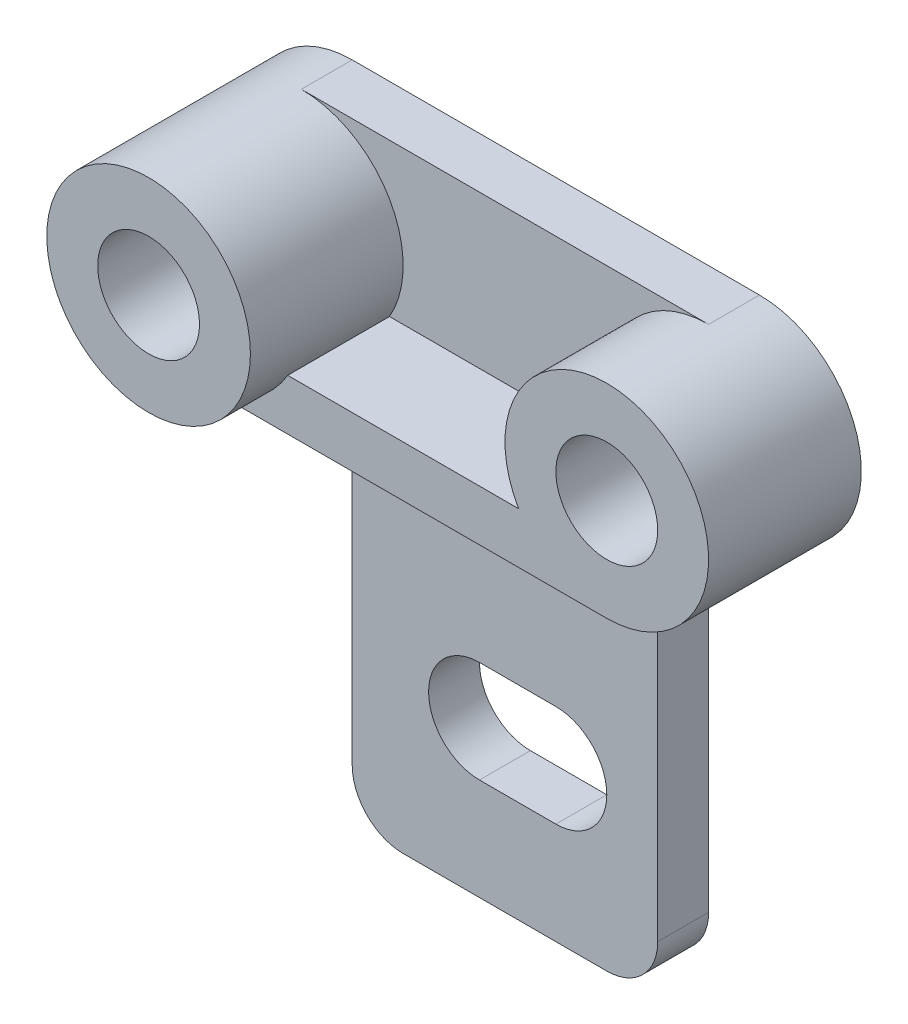
ISO-10303-21;
HEADER;
FILE_DESCRIPTION(('STEP AP214'),'2;1');
FILE_NAME('part.step','',(''),(''),'','','');
FILE_SCHEMA(('AUTOMOTIVE_DESIGN { 1 0 10303 214 1 1 1 1 }'));
ENDSEC;
DATA;
#1=APPLICATION_CONTEXT('core data for automotive mechanical design processes');
#2=APPLICATION_PROTOCOL_DEFINITION('international standard','automotive_design',2000,#1);
#3=PRODUCT_CONTEXT('',#1,'mechanical');
#4=PRODUCT('Part','Part','',(#3));
#5=PRODUCT_RELATED_PRODUCT_CATEGORY('part','',(#4));
#6=PRODUCT_DEFINITION_FORMATION('','',#4);
#7=PRODUCT_DEFINITION_CONTEXT('part definition',#1,'design');
#8=PRODUCT_DEFINITION('design','',#6,#7);
#9=PRODUCT_DEFINITION_SHAPE('','',#8);
#10=(LENGTH_UNIT() NAMED_UNIT(*) SI_UNIT(.MILLI.,.METRE.));
#11=(NAMED_UNIT(*) PLANE_ANGLE_UNIT() SI_UNIT($,.RADIAN.));
#12=(NAMED_UNIT(*) SI_UNIT($,.STERADIAN.) SOLID_ANGLE_UNIT());
#13=UNCERTAINTY_MEASURE_WITH_UNIT(LENGTH_MEASURE(1.E-05),#10,'distance_accuracy_value','');
#14=(GEOMETRIC_REPRESENTATION_CONTEXT(3) GLOBAL_UNCERTAINTY_ASSIGNED_CONTEXT((#13)) GLOBAL_UNIT_ASSIGNED_CONTEXT((#10,
#11,#12)) REPRESENTATION_CONTEXT('',''));
#15=CARTESIAN_POINT('',(0.,0.,0.));
#16=DIRECTION('',(0.,0.,1.));
#17=DIRECTION('',(1.,0.,0.));
#18=AXIS2_PLACEMENT_3D('',#15,#16,#17);
#19=CARTESIAN_POINT('',(40.,100.,30.));
#20=DIRECTION('',(0.,0.,-1.));
#21=DIRECTION('',(-1.,0.,0.));
#22=AXIS2_PLACEMENT_3D('',#19,#20,#21);
#23=CYLINDRICAL_SURFACE('',#22,20.);
#24=DIRECTION('',(0.,0.,-1.));
#25=VECTOR('',#24,1.);
#26=CARTESIAN_POINT('',(40.,120.,10.));
#27=LINE('',#26,#25);
#28=CARTESIAN_POINT('',(40.,120.,10.));
#29=VERTEX_POINT('',#28);
#30=CARTESIAN_POINT('',(40.,120.,0.));
#31=VERTEX_POINT('',#30);
#32=EDGE_CURVE('E196',#29,#31,#27,.T.);
#33=ORIENTED_EDGE('',*,*,#32,.F.);
#34=CARTESIAN_POINT('',(40.,100.,10.));
#35=DIRECTION('',(0.,0.,1.));
#36=DIRECTION('',(1.,0.,0.));
#37=AXIS2_PLACEMENT_3D('',#34,#35,#36);
#38=CIRCLE('',#37,20.);
#39=CARTESIAN_POINT('',(22.6794919243112,90.,10.));
#40=VERTEX_POINT('',#39);
#41=EDGE_CURVE('E184',#29,#40,#38,.T.);
#42=ORIENTED_EDGE('',*,*,#41,.T.);
#43=DIRECTION('',(0.,0.,-1.));
#44=VECTOR('',#43,1.);
#45=CARTESIAN_POINT('',(22.6794919243112,90.,30.));
#46=LINE('',#45,#44);
#47=CARTESIAN_POINT('',(22.6794919243112,90.,30.));
#48=VERTEX_POINT('',#47);
#49=EDGE_CURVE('E239',#48,#40,#46,.T.);
#50=ORIENTED_EDGE('',*,*,#49,.F.);
#51=CARTESIAN_POINT('',(40.,100.,30.));
#52=DIRECTION('',(0.,0.,1.));
#53=DIRECTION('',(1.,0.,0.));
#54=AXIS2_PLACEMENT_3D('',#51,#52,#53);
#55=CIRCLE('',#54,20.);
#56=CARTESIAN_POINT('',(40.,80.,30.));
#57=VERTEX_POINT('',#56);
#58=EDGE_CURVE('E215',#57,#48,#55,.T.);
#59=ORIENTED_EDGE('',*,*,#58,.F.);
#60=DIRECTION('',(0.,0.,-1.));
#61=VECTOR('',#60,1.);
#62=CARTESIAN_POINT('',(40.,80.,30.));
#63=LINE('',#62,#61);
#64=CARTESIAN_POINT('',(40.,80.,0.));
#65=VERTEX_POINT('',#64);
#66=EDGE_CURVE('E225',#57,#65,#63,.T.);
#67=ORIENTED_EDGE('',*,*,#66,.T.);
#68=CARTESIAN_POINT('',(40.,100.,0.));
#69=DIRECTION('',(0.,0.,1.));
#70=DIRECTION('',(1.,0.,0.));
#71=AXIS2_PLACEMENT_3D('',#68,#69,#70);
#72=CIRCLE('',#71,20.);
#73=EDGE_CURVE('E228',#65,#31,#72,.T.);
#74=ORIENTED_EDGE('',*,*,#73,.T.);
#75=EDGE_LOOP('',(#33,#42,#50,#59,#67,#74));
#76=FACE_BOUND('',#75,.T.);
#77=ADVANCED_FACE('F63',(#76),#23,.T.);
#78=CARTESIAN_POINT('',(0.,0.,10.));
#79=DIRECTION('',(0.,0.,1.));
#80=DIRECTION('',(1.,0.,0.));
#81=AXIS2_PLACEMENT_3D('',#78,#79,#80);
#82=PLANE('',#81);
#83=DIRECTION('',(0.,1.,0.));
#84=VECTOR('',#83,1.);
#85=CARTESIAN_POINT('',(-30.,0.,10.));
#86=LINE('',#85,#84);
#87=CARTESIAN_POINT('',(-30.,10.,10.));
#88=VERTEX_POINT('',#87);
#89=CARTESIAN_POINT('',(-30.,80.,10.));
#90=VERTEX_POINT('',#89);
#91=EDGE_CURVE('E283',#88,#90,#86,.T.);
#92=ORIENTED_EDGE('',*,*,#91,.F.);
#93=CARTESIAN_POINT('',(-20.,10.,10.));
#94=DIRECTION('',(0.,0.,1.));
#95=DIRECTION('',(1.,0.,0.));
#96=AXIS2_PLACEMENT_3D('',#93,#94,#95);
#97=CIRCLE('',#96,10.);
#98=CARTESIAN_POINT('',(-20.,0.,10.));
#99=VERTEX_POINT('',#98);
#100=EDGE_CURVE('E71',#88,#99,#97,.T.);
#101=ORIENTED_EDGE('',*,*,#100,.T.);
#102=DIRECTION('',(1.,0.,0.));
#103=VECTOR('',#102,1.);
#104=CARTESIAN_POINT('',(-30.,0.,10.));
#105=LINE('',#104,#103);
#106=CARTESIAN_POINT('',(20.,0.,10.));
#107=VERTEX_POINT('',#106);
#108=EDGE_CURVE('E281',#99,#107,#105,.T.);
#109=ORIENTED_EDGE('',*,*,#108,.T.);
#110=CARTESIAN_POINT('',(20.,10.,10.));
#111=DIRECTION('',(0.,0.,1.));
#112=DIRECTION('',(1.,0.,0.));
#113=AXIS2_PLACEMENT_3D('',#110,#111,#112);
#114=CIRCLE('',#113,10.);
#115=CARTESIAN_POINT('',(30.,10.,10.));
#116=VERTEX_POINT('',#115);
#117=EDGE_CURVE('E78',#107,#116,#114,.T.);
#118=ORIENTED_EDGE('',*,*,#117,.T.);
#119=DIRECTION('',(0.,1.,0.));
#120=VECTOR('',#119,1.);
#121=CARTESIAN_POINT('',(30.,0.,10.));
#122=LINE('',#121,#120);
#123=CARTESIAN_POINT('',(30.,80.,10.));
#124=VERTEX_POINT('',#123);
#125=EDGE_CURVE('E278',#116,#124,#122,.T.);
#126=ORIENTED_EDGE('',*,*,#125,.T.);
#127=DIRECTION('',(1.,0.,0.));
#128=VECTOR('',#127,1.);
#129=CARTESIAN_POINT('',(-30.,80.,10.));
#130=LINE('',#129,#128);
#131=EDGE_CURVE('E275',#90,#124,#130,.T.);
#132=ORIENTED_EDGE('',*,*,#131,.F.);
#133=EDGE_LOOP('',(#92,#101,#109,#118,#126,#132));
#134=FACE_BOUND('',#133,.T.);
#135=DIRECTION('',(1.,0.,0.));
#136=VECTOR('',#135,1.);
#137=CARTESIAN_POINT('',(-5.,20.,10.));
#138=LINE('',#137,#136);
#139=CARTESIAN_POINT('',(-5.,20.,10.));
#140=VERTEX_POINT('',#139);
#141=CARTESIAN_POINT('',(10.,20.,10.));
#142=VERTEX_POINT('',#141);
#143=EDGE_CURVE('E245',#140,#142,#138,.T.);
#144=ORIENTED_EDGE('',*,*,#143,.F.);
#145=CARTESIAN_POINT('',(-5.,30.,10.));
#146=DIRECTION('',(0.,0.,1.));
#147=DIRECTION('',(1.,0.,0.));
#148=AXIS2_PLACEMENT_3D('',#145,#146,#147);
#149=CIRCLE('',#148,10.);
#150=CARTESIAN_POINT('',(-5.,40.,10.));
#151=VERTEX_POINT('',#150);
#152=EDGE_CURVE('E243',#151,#140,#149,.T.);
#153=ORIENTED_EDGE('',*,*,#152,.F.);
#154=DIRECTION('',(1.,0.,0.));
#155=VECTOR('',#154,1.);
#156=CARTESIAN_POINT('',(-5.,40.,10.));
#157=LINE('',#156,#155);
#158=CARTESIAN_POINT('',(10.,40.,10.));
#159=VERTEX_POINT('',#158);
#160=EDGE_CURVE('E251',#151,#159,#157,.T.);
#161=ORIENTED_EDGE('',*,*,#160,.T.);
#162=CARTESIAN_POINT('',(10.,30.,10.));
#163=DIRECTION('',(0.,0.,1.));
#164=DIRECTION('',(1.,0.,0.));
#165=AXIS2_PLACEMENT_3D('',#162,#163,#164);
#166=CIRCLE('',#165,10.);
#167=EDGE_CURVE('E248',#142,#159,#166,.T.);
#168=ORIENTED_EDGE('',*,*,#167,.F.);
#169=EDGE_LOOP('',(#144,#153,#161,#168));
#170=FACE_BOUND('',#169,.T.);
#171=ADVANCED_FACE('F308',(#134,#170),#82,.T.);
#172=CARTESIAN_POINT('',(0.,0.,0.));
#173=DIRECTION('',(0.,0.,1.));
#174=DIRECTION('',(1.,0.,0.));
#175=AXIS2_PLACEMENT_3D('',#172,#173,#174);
#176=PLANE('',#175);
#177=DIRECTION('',(1.,0.,0.));
#178=VECTOR('',#177,1.);
#179=CARTESIAN_POINT('',(-30.,0.,0.));
#180=LINE('',#179,#178);
#181=CARTESIAN_POINT('',(-20.,0.,0.));
#182=VERTEX_POINT('',#181);
#183=CARTESIAN_POINT('',(20.,0.,0.));
#184=VERTEX_POINT('',#183);
#185=EDGE_CURVE('E287',#182,#184,#180,.T.);
#186=ORIENTED_EDGE('',*,*,#185,.F.);
#187=CARTESIAN_POINT('',(-20.,10.,0.));
#188=DIRECTION('',(0.,0.,1.));
#189=DIRECTION('',(1.,0.,0.));
#190=AXIS2_PLACEMENT_3D('',#187,#188,#189);
#191=CIRCLE('',#190,10.);
#192=CARTESIAN_POINT('',(-30.,10.,0.));
#193=VERTEX_POINT('',#192);
#194=EDGE_CURVE('E303',#182,#193,#191,.F.);
#195=ORIENTED_EDGE('',*,*,#194,.T.);
#196=DIRECTION('',(0.,1.,0.));
#197=VECTOR('',#196,1.);
#198=CARTESIAN_POINT('',(-30.,0.,0.));
#199=LINE('',#198,#197);
#200=CARTESIAN_POINT('',(-30.,80.,0.));
#201=VERTEX_POINT('',#200);
#202=EDGE_CURVE('E279',#193,#201,#199,.T.);
#203=ORIENTED_EDGE('',*,*,#202,.T.);
#204=DIRECTION('',(1.,0.,0.));
#205=VECTOR('',#204,1.);
#206=CARTESIAN_POINT('',(0.,80.,0.));
#207=LINE('',#206,#205);
#208=CARTESIAN_POINT('',(-40.,80.,0.));
#209=VERTEX_POINT('',#208);
#210=EDGE_CURVE('E216',#209,#201,#207,.T.);
#211=ORIENTED_EDGE('',*,*,#210,.F.);
#212=CARTESIAN_POINT('',(-40.,100.,0.));
#213=DIRECTION('',(0.,0.,1.));
#214=DIRECTION('',(1.,0.,0.));
#215=AXIS2_PLACEMENT_3D('',#212,#213,#214);
#216=CIRCLE('',#215,20.);
#217=CARTESIAN_POINT('',(-40.,120.,0.));
#218=VERTEX_POINT('',#217);
#219=EDGE_CURVE('E327',#218,#209,#216,.T.);
#220=ORIENTED_EDGE('',*,*,#219,.F.);
#221=DIRECTION('',(1.,0.,0.));
#222=VECTOR('',#221,1.);
#223=CARTESIAN_POINT('',(0.,120.,0.));
#224=LINE('',#223,#222);
#225=EDGE_CURVE('E192',#218,#31,#224,.T.);
#226=ORIENTED_EDGE('',*,*,#225,.T.);
#227=ORIENTED_EDGE('',*,*,#73,.F.);
#228=CARTESIAN_POINT('',(30.,80.,0.));
#229=VERTEX_POINT('',#228);
#230=EDGE_CURVE('E231',#229,#65,#207,.T.);
#231=ORIENTED_EDGE('',*,*,#230,.F.);
#232=DIRECTION('',(0.,1.,0.));
#233=VECTOR('',#232,1.);
#234=CARTESIAN_POINT('',(30.,0.,0.));
#235=LINE('',#234,#233);
#236=CARTESIAN_POINT('',(30.,10.,0.));
#237=VERTEX_POINT('',#236);
#238=EDGE_CURVE('E274',#237,#229,#235,.T.);
#239=ORIENTED_EDGE('',*,*,#238,.F.);
#240=CARTESIAN_POINT('',(20.,10.,0.));
#241=DIRECTION('',(0.,0.,1.));
#242=DIRECTION('',(1.,0.,0.));
#243=AXIS2_PLACEMENT_3D('',#240,#241,#242);
#244=CIRCLE('',#243,10.);
#245=EDGE_CURVE('E301',#237,#184,#244,.F.);
#246=ORIENTED_EDGE('',*,*,#245,.T.);
#247=EDGE_LOOP('',(#186,#195,#203,#211,#220,#226,#227,#231,#239,#246));
#248=FACE_BOUND('',#247,.T.);
#249=CARTESIAN_POINT('',(-5.,30.,0.));
#250=DIRECTION('',(0.,0.,1.));
#251=DIRECTION('',(1.,0.,0.));
#252=AXIS2_PLACEMENT_3D('',#249,#250,#251);
#253=CIRCLE('',#252,10.);
#254=CARTESIAN_POINT('',(-5.,40.,0.));
#255=VERTEX_POINT('',#254);
#256=CARTESIAN_POINT('',(-5.,20.,0.));
#257=VERTEX_POINT('',#256);
#258=EDGE_CURVE('E242',#255,#257,#253,.T.);
#259=ORIENTED_EDGE('',*,*,#258,.T.);
#260=DIRECTION('',(1.,0.,0.));
#261=VECTOR('',#260,1.);
#262=CARTESIAN_POINT('',(-5.,20.,0.));
#263=LINE('',#262,#261);
#264=CARTESIAN_POINT('',(10.,20.,0.));
#265=VERTEX_POINT('',#264);
#266=EDGE_CURVE('E257',#257,#265,#263,.T.);
#267=ORIENTED_EDGE('',*,*,#266,.T.);
#268=CARTESIAN_POINT('',(10.,30.,0.));
#269=DIRECTION('',(0.,0.,1.));
#270=DIRECTION('',(1.,0.,0.));
#271=AXIS2_PLACEMENT_3D('',#268,#269,#270);
#272=CIRCLE('',#271,10.);
#273=CARTESIAN_POINT('',(10.,40.,0.));
#274=VERTEX_POINT('',#273);
#275=EDGE_CURVE('E260',#265,#274,#272,.T.);
#276=ORIENTED_EDGE('',*,*,#275,.T.);
#277=DIRECTION('',(1.,0.,0.));
#278=VECTOR('',#277,1.);
#279=CARTESIAN_POINT('',(-5.,40.,0.));
#280=LINE('',#279,#278);
#281=EDGE_CURVE('E246',#255,#274,#280,.T.);
#282=ORIENTED_EDGE('',*,*,#281,.F.);
#283=EDGE_LOOP('',(#259,#267,#276,#282));
#284=FACE_BOUND('',#283,.T.);
#285=CARTESIAN_POINT('',(40.,100.,0.));
#286=DIRECTION('',(0.,0.,1.));
#287=DIRECTION('',(1.,0.,0.));
#288=AXIS2_PLACEMENT_3D('',#285,#286,#287);
#289=CIRCLE('',#288,9.99999999999997);
#290=CARTESIAN_POINT('',(50.,100.,0.));
#291=VERTEX_POINT('',#290);
#292=EDGE_CURVE('E211',#291,#291,#289,.T.);
#293=ORIENTED_EDGE('',*,*,#292,.T.);
#294=EDGE_LOOP('',(#293));
#295=FACE_BOUND('',#294,.T.);
#296=CARTESIAN_POINT('',(-40.,100.,0.));
#297=DIRECTION('',(0.,0.,1.));
#298=DIRECTION('',(1.,0.,0.));
#299=AXIS2_PLACEMENT_3D('',#296,#297,#298);
#300=CIRCLE('',#299,9.99999999999999);
#301=CARTESIAN_POINT('',(-30.,100.,0.));
#302=VERTEX_POINT('',#301);
#303=EDGE_CURVE('E329',#302,#302,#300,.T.);
#304=ORIENTED_EDGE('',*,*,#303,.T.);
#305=EDGE_LOOP('',(#304));
#306=FACE_BOUND('',#305,.T.);
#307=ADVANCED_FACE('F319',(#248,#284,#295,#306),#176,.F.);
#308=CARTESIAN_POINT('',(-30.,0.,10.));
#309=DIRECTION('',(-1.,0.,0.));
#310=DIRECTION('',(0.,0.,1.));
#311=AXIS2_PLACEMENT_3D('',#308,#309,#310);
#312=PLANE('',#311);
#313=ORIENTED_EDGE('',*,*,#202,.F.);
#314=DIRECTION('',(0.,0.,-1.));
#315=VECTOR('',#314,1.);
#316=CARTESIAN_POINT('',(-30.,10.,10.));
#317=LINE('',#316,#315);
#318=EDGE_CURVE('E86',#193,#88,#317,.F.);
#319=ORIENTED_EDGE('',*,*,#318,.T.);
#320=ORIENTED_EDGE('',*,*,#91,.T.);
#321=DIRECTION('',(0.,0.,-1.));
#322=VECTOR('',#321,1.);
#323=CARTESIAN_POINT('',(-30.,80.,10.));
#324=LINE('',#323,#322);
#325=EDGE_CURVE('E291',#90,#201,#324,.T.);
#326=ORIENTED_EDGE('',*,*,#325,.T.);
#327=EDGE_LOOP('',(#313,#319,#320,#326));
#328=FACE_BOUND('',#327,.T.);
#329=ADVANCED_FACE('F322',(#328),#312,.T.);
#330=CARTESIAN_POINT('',(-30.,0.,10.));
#331=DIRECTION('',(0.,1.,0.));
#332=DIRECTION('',(0.,0.,1.));
#333=AXIS2_PLACEMENT_3D('',#330,#331,#332);
#334=PLANE('',#333);
#335=ORIENTED_EDGE('',*,*,#108,.F.);
#336=DIRECTION('',(0.,0.,-1.));
#337=VECTOR('',#336,1.);
#338=CARTESIAN_POINT('',(-20.,0.,0.));
#339=LINE('',#338,#337);
#340=EDGE_CURVE('E298',#99,#182,#339,.T.);
#341=ORIENTED_EDGE('',*,*,#340,.T.);
#342=ORIENTED_EDGE('',*,*,#185,.T.);
#343=DIRECTION('',(0.,0.,-1.));
#344=VECTOR('',#343,1.);
#345=CARTESIAN_POINT('',(20.,0.,10.));
#346=LINE('',#345,#344);
#347=EDGE_CURVE('E294',#184,#107,#346,.F.);
#348=ORIENTED_EDGE('',*,*,#347,.T.);
#349=EDGE_LOOP('',(#335,#341,#342,#348));
#350=FACE_BOUND('',#349,.T.);
#351=ADVANCED_FACE('F314',(#350),#334,.F.);
#352=CARTESIAN_POINT('',(30.,0.,10.));
#353=DIRECTION('',(-1.,0.,0.));
#354=DIRECTION('',(0.,0.,1.));
#355=AXIS2_PLACEMENT_3D('',#352,#353,#354);
#356=PLANE('',#355);
#357=ORIENTED_EDGE('',*,*,#125,.F.);
#358=DIRECTION('',(0.,0.,-1.));
#359=VECTOR('',#358,1.);
#360=CARTESIAN_POINT('',(30.,10.,10.));
#361=LINE('',#360,#359);
#362=EDGE_CURVE('E12',#116,#237,#361,.T.);
#363=ORIENTED_EDGE('',*,*,#362,.T.);
#364=ORIENTED_EDGE('',*,*,#238,.T.);
#365=DIRECTION('',(0.,0.,-1.));
#366=VECTOR('',#365,1.);
#367=CARTESIAN_POINT('',(30.,80.,10.));
#368=LINE('',#367,#366);
#369=EDGE_CURVE('E285',#124,#229,#368,.T.);
#370=ORIENTED_EDGE('',*,*,#369,.F.);
#371=EDGE_LOOP('',(#357,#363,#364,#370));
#372=FACE_BOUND('',#371,.T.);
#373=ADVANCED_FACE('F350',(#372),#356,.F.);
#374=CARTESIAN_POINT('',(-5.,30.,10.));
#375=DIRECTION('',(0.,0.,-1.));
#376=DIRECTION('',(-1.,0.,0.));
#377=AXIS2_PLACEMENT_3D('',#374,#375,#376);
#378=CYLINDRICAL_SURFACE('',#377,10.);
#379=ORIENTED_EDGE('',*,*,#258,.F.);
#380=DIRECTION('',(0.,0.,-1.));
#381=VECTOR('',#380,1.);
#382=CARTESIAN_POINT('',(-5.,40.,10.));
#383=LINE('',#382,#381);
#384=EDGE_CURVE('E254',#151,#255,#383,.T.);
#385=ORIENTED_EDGE('',*,*,#384,.F.);
#386=ORIENTED_EDGE('',*,*,#152,.T.);
#387=DIRECTION('',(0.,0.,-1.));
#388=VECTOR('',#387,1.);
#389=CARTESIAN_POINT('',(-5.,20.,10.));
#390=LINE('',#389,#388);
#391=EDGE_CURVE('E271',#140,#257,#390,.T.);
#392=ORIENTED_EDGE('',*,*,#391,.T.);
#393=EDGE_LOOP('',(#379,#385,#386,#392));
#394=FACE_BOUND('',#393,.T.);
#395=ADVANCED_FACE('F382',(#394),#378,.F.);
#396=CARTESIAN_POINT('',(-5.,20.,10.));
#397=DIRECTION('',(0.,1.,0.));
#398=DIRECTION('',(0.,0.,1.));
#399=AXIS2_PLACEMENT_3D('',#396,#397,#398);
#400=PLANE('',#399);
#401=ORIENTED_EDGE('',*,*,#266,.F.);
#402=ORIENTED_EDGE('',*,*,#391,.F.);
#403=ORIENTED_EDGE('',*,*,#143,.T.);
#404=DIRECTION('',(0.,0.,-1.));
#405=VECTOR('',#404,1.);
#406=CARTESIAN_POINT('',(10.,20.,10.));
#407=LINE('',#406,#405);
#408=EDGE_CURVE('E269',#142,#265,#407,.T.);
#409=ORIENTED_EDGE('',*,*,#408,.T.);
#410=EDGE_LOOP('',(#401,#402,#403,#409));
#411=FACE_BOUND('',#410,.T.);
#412=ADVANCED_FACE('F378',(#411),#400,.T.);
#413=CARTESIAN_POINT('',(10.,30.,10.));
#414=DIRECTION('',(0.,0.,-1.));
#415=DIRECTION('',(-1.,0.,0.));
#416=AXIS2_PLACEMENT_3D('',#413,#414,#415);
#417=CYLINDRICAL_SURFACE('',#416,10.);
#418=ORIENTED_EDGE('',*,*,#275,.F.);
#419=ORIENTED_EDGE('',*,*,#408,.F.);
#420=ORIENTED_EDGE('',*,*,#167,.T.);
#421=DIRECTION('',(0.,0.,-1.));
#422=VECTOR('',#421,1.);
#423=CARTESIAN_POINT('',(10.,40.,10.));
#424=LINE('',#423,#422);
#425=EDGE_CURVE('E267',#159,#274,#424,.T.);
#426=ORIENTED_EDGE('',*,*,#425,.T.);
#427=EDGE_LOOP('',(#418,#419,#420,#426));
#428=FACE_BOUND('',#427,.T.);
#429=ADVANCED_FACE('F374',(#428),#417,.F.);
#430=CARTESIAN_POINT('',(-5.,40.,10.));
#431=DIRECTION('',(0.,1.,0.));
#432=DIRECTION('',(0.,0.,1.));
#433=AXIS2_PLACEMENT_3D('',#430,#431,#432);
#434=PLANE('',#433);
#435=ORIENTED_EDGE('',*,*,#281,.T.);
#436=ORIENTED_EDGE('',*,*,#425,.F.);
#437=ORIENTED_EDGE('',*,*,#160,.F.);
#438=ORIENTED_EDGE('',*,*,#384,.T.);
#439=EDGE_LOOP('',(#435,#436,#437,#438));
#440=FACE_BOUND('',#439,.T.);
#441=ADVANCED_FACE('F372',(#440),#434,.F.);
#442=CARTESIAN_POINT('',(0.,90.,30.));
#443=DIRECTION('',(0.,-1.,0.));
#444=DIRECTION('',(0.,0.,-1.));
#445=AXIS2_PLACEMENT_3D('',#442,#443,#444);
#446=PLANE('',#445);
#447=ORIENTED_EDGE('',*,*,#49,.T.);
#448=DIRECTION('',(-1.,0.,0.));
#449=VECTOR('',#448,1.);
#450=CARTESIAN_POINT('',(0.,90.,10.));
#451=LINE('',#450,#449);
#452=CARTESIAN_POINT('',(-22.6794919243112,90.,10.));
#453=VERTEX_POINT('',#452);
#454=EDGE_CURVE('E197',#40,#453,#451,.T.);
#455=ORIENTED_EDGE('',*,*,#454,.T.);
#456=DIRECTION('',(0.,0.,-1.));
#457=VECTOR('',#456,1.);
#458=CARTESIAN_POINT('',(-22.6794919243112,90.,30.));
#459=LINE('',#458,#457);
#460=CARTESIAN_POINT('',(-22.6794919243112,90.,30.));
#461=VERTEX_POINT('',#460);
#462=EDGE_CURVE('E203',#461,#453,#459,.T.);
#463=ORIENTED_EDGE('',*,*,#462,.F.);
#464=DIRECTION('',(-1.,0.,0.));
#465=VECTOR('',#464,1.);
#466=CARTESIAN_POINT('',(0.,90.,30.));
#467=LINE('',#466,#465);
#468=EDGE_CURVE('E219',#48,#461,#467,.T.);
#469=ORIENTED_EDGE('',*,*,#468,.F.);
#470=EDGE_LOOP('',(#447,#455,#463,#469));
#471=FACE_BOUND('',#470,.T.);
#472=ADVANCED_FACE('F340',(#471),#446,.F.);
#473=CARTESIAN_POINT('',(40.,100.,30.));
#474=DIRECTION('',(0.,0.,-1.));
#475=DIRECTION('',(-1.,0.,0.));
#476=AXIS2_PLACEMENT_3D('',#473,#474,#475);
#477=CYLINDRICAL_SURFACE('',#476,9.99999999999997);
#478=CARTESIAN_POINT('',(40.,100.,30.));
#479=DIRECTION('',(0.,0.,1.));
#480=DIRECTION('',(1.,0.,0.));
#481=AXIS2_PLACEMENT_3D('',#478,#479,#480);
#482=CIRCLE('',#481,9.99999999999997);
#483=CARTESIAN_POINT('',(50.,100.,30.));
#484=VERTEX_POINT('',#483);
#485=EDGE_CURVE('E212',#484,#484,#482,.T.);
#486=ORIENTED_EDGE('',*,*,#485,.T.);
#487=EDGE_LOOP('',(#486));
#488=FACE_BOUND('',#487,.T.);
#489=ORIENTED_EDGE('',*,*,#292,.F.);
#490=EDGE_LOOP('',(#489));
#491=FACE_BOUND('',#490,.T.);
#492=ADVANCED_FACE('F369',(#488,#491),#477,.F.);
#493=CARTESIAN_POINT('',(0.,80.,30.));
#494=DIRECTION('',(0.,1.,0.));
#495=DIRECTION('',(0.,0.,1.));
#496=AXIS2_PLACEMENT_3D('',#493,#494,#495);
#497=PLANE('',#496);
#498=ORIENTED_EDGE('',*,*,#325,.F.);
#499=ORIENTED_EDGE('',*,*,#131,.T.);
#500=ORIENTED_EDGE('',*,*,#369,.T.);
#501=ORIENTED_EDGE('',*,*,#230,.T.);
#502=ORIENTED_EDGE('',*,*,#66,.F.);
#503=DIRECTION('',(1.,0.,0.));
#504=VECTOR('',#503,1.);
#505=CARTESIAN_POINT('',(0.,80.,30.));
#506=LINE('',#505,#504);
#507=CARTESIAN_POINT('',(-40.,80.,30.));
#508=VERTEX_POINT('',#507);
#509=EDGE_CURVE('E223',#508,#57,#506,.T.);
#510=ORIENTED_EDGE('',*,*,#509,.F.);
#511=DIRECTION('',(0.,0.,-1.));
#512=VECTOR('',#511,1.);
#513=CARTESIAN_POINT('',(-40.,80.,30.));
#514=LINE('',#513,#512);
#515=EDGE_CURVE('E236',#508,#209,#514,.T.);
#516=ORIENTED_EDGE('',*,*,#515,.T.);
#517=ORIENTED_EDGE('',*,*,#210,.T.);
#518=EDGE_LOOP('',(#498,#499,#500,#501,#502,#510,#516,#517));
#519=FACE_BOUND('',#518,.T.);
#520=ADVANCED_FACE('F325',(#519),#497,.F.);
#521=CARTESIAN_POINT('',(0.,0.,30.));
#522=DIRECTION('',(0.,0.,1.));
#523=DIRECTION('',(1.,0.,0.));
#524=AXIS2_PLACEMENT_3D('',#521,#522,#523);
#525=PLANE('',#524);
#526=ORIENTED_EDGE('',*,*,#485,.F.);
#527=EDGE_LOOP('',(#526));
#528=FACE_BOUND('',#527,.T.);
#529=ORIENTED_EDGE('',*,*,#58,.T.);
#530=ORIENTED_EDGE('',*,*,#468,.T.);
#531=CARTESIAN_POINT('',(-40.,100.,30.));
#532=DIRECTION('',(0.,0.,1.));
#533=DIRECTION('',(1.,0.,0.));
#534=AXIS2_PLACEMENT_3D('',#531,#532,#533);
#535=CIRCLE('',#534,20.);
#536=EDGE_CURVE('E221',#508,#461,#535,.T.);
#537=ORIENTED_EDGE('',*,*,#536,.F.);
#538=ORIENTED_EDGE('',*,*,#509,.T.);
#539=EDGE_LOOP('',(#529,#530,#537,#538));
#540=FACE_BOUND('',#539,.T.);
#541=ADVANCED_FACE('F343',(#528,#540),#525,.T.);
#542=CARTESIAN_POINT('',(0.,120.,10.));
#543=DIRECTION('',(0.,1.,0.));
#544=DIRECTION('',(0.,0.,1.));
#545=AXIS2_PLACEMENT_3D('',#542,#543,#544);
#546=PLANE('',#545);
#547=ORIENTED_EDGE('',*,*,#225,.F.);
#548=DIRECTION('',(0.,0.,-1.));
#549=VECTOR('',#548,1.);
#550=CARTESIAN_POINT('',(-40.,120.,10.));
#551=LINE('',#550,#549);
#552=CARTESIAN_POINT('',(-40.,120.,10.));
#553=VERTEX_POINT('',#552);
#554=EDGE_CURVE('E189',#553,#218,#551,.T.);
#555=ORIENTED_EDGE('',*,*,#554,.F.);
#556=DIRECTION('',(1.,0.,0.));
#557=VECTOR('',#556,1.);
#558=CARTESIAN_POINT('',(0.,120.,10.));
#559=LINE('',#558,#557);
#560=EDGE_CURVE('E177',#553,#29,#559,.T.);
#561=ORIENTED_EDGE('',*,*,#560,.T.);
#562=ORIENTED_EDGE('',*,*,#32,.T.);
#563=EDGE_LOOP('',(#547,#555,#561,#562));
#564=FACE_BOUND('',#563,.T.);
#565=ADVANCED_FACE('F190',(#564),#546,.T.);
#566=CARTESIAN_POINT('',(0.,0.,10.));
#567=DIRECTION('',(0.,0.,1.));
#568=DIRECTION('',(1.,0.,0.));
#569=AXIS2_PLACEMENT_3D('',#566,#567,#568);
#570=PLANE('',#569);
#571=ORIENTED_EDGE('',*,*,#41,.F.);
#572=ORIENTED_EDGE('',*,*,#560,.F.);
#573=CARTESIAN_POINT('',(-40.,100.,10.));
#574=DIRECTION('',(0.,0.,1.));
#575=DIRECTION('',(1.,0.,0.));
#576=AXIS2_PLACEMENT_3D('',#573,#574,#575);
#577=CIRCLE('',#576,20.);
#578=EDGE_CURVE('E181',#453,#553,#577,.T.);
#579=ORIENTED_EDGE('',*,*,#578,.F.);
#580=ORIENTED_EDGE('',*,*,#454,.F.);
#581=EDGE_LOOP('',(#571,#572,#579,#580));
#582=FACE_BOUND('',#581,.T.);
#583=ADVANCED_FACE('F179',(#582),#570,.T.);
#584=CARTESIAN_POINT('',(-40.,100.,40.));
#585=DIRECTION('',(0.,0.,-1.));
#586=DIRECTION('',(-1.,0.,0.));
#587=AXIS2_PLACEMENT_3D('',#584,#585,#586);
#588=CYLINDRICAL_SURFACE('',#587,20.);
#589=CARTESIAN_POINT('',(-40.,100.,40.));
#590=DIRECTION('',(0.,0.,1.));
#591=DIRECTION('',(1.,0.,0.));
#592=AXIS2_PLACEMENT_3D('',#589,#590,#591);
#593=CIRCLE('',#592,20.);
#594=CARTESIAN_POINT('',(-20.,100.,40.));
#595=VERTEX_POINT('',#594);
#596=EDGE_CURVE('E208',#595,#595,#593,.T.);
#597=ORIENTED_EDGE('',*,*,#596,.F.);
#598=EDGE_LOOP('',(#597));
#599=FACE_BOUND('',#598,.T.);
#600=ORIENTED_EDGE('',*,*,#219,.T.);
#601=ORIENTED_EDGE('',*,*,#515,.F.);
#602=ORIENTED_EDGE('',*,*,#536,.T.);
#603=ORIENTED_EDGE('',*,*,#462,.T.);
#604=ORIENTED_EDGE('',*,*,#578,.T.);
#605=ORIENTED_EDGE('',*,*,#554,.T.);
#606=EDGE_LOOP('',(#600,#601,#602,#603,#604,#605));
#607=FACE_BOUND('',#606,.T.);
#608=ADVANCED_FACE('F200',(#599,#607),#588,.T.);
#609=CARTESIAN_POINT('',(-40.,100.,40.));
#610=DIRECTION('',(0.,0.,-1.));
#611=DIRECTION('',(-1.,0.,0.));
#612=AXIS2_PLACEMENT_3D('',#609,#610,#611);
#613=CYLINDRICAL_SURFACE('',#612,9.99999999999999);
#614=CARTESIAN_POINT('',(-40.,100.,40.));
#615=DIRECTION('',(0.,0.,1.));
#616=DIRECTION('',(1.,0.,0.));
#617=AXIS2_PLACEMENT_3D('',#614,#615,#616);
#618=CIRCLE('',#617,9.99999999999999);
#619=CARTESIAN_POINT('',(-30.,100.,40.));
#620=VERTEX_POINT('',#619);
#621=EDGE_CURVE('E328',#620,#620,#618,.T.);
#622=ORIENTED_EDGE('',*,*,#621,.T.);
#623=EDGE_LOOP('',(#622));
#624=FACE_BOUND('',#623,.T.);
#625=ORIENTED_EDGE('',*,*,#303,.F.);
#626=EDGE_LOOP('',(#625));
#627=FACE_BOUND('',#626,.T.);
#628=ADVANCED_FACE('F418',(#624,#627),#613,.F.);
#629=CARTESIAN_POINT('',(0.,0.,40.));
#630=DIRECTION('',(0.,0.,1.));
#631=DIRECTION('',(1.,0.,0.));
#632=AXIS2_PLACEMENT_3D('',#629,#630,#631);
#633=PLANE('',#632);
#634=ORIENTED_EDGE('',*,*,#621,.F.);
#635=EDGE_LOOP('',(#634));
#636=FACE_BOUND('',#635,.T.);
#637=ORIENTED_EDGE('',*,*,#596,.T.);
#638=EDGE_LOOP('',(#637));
#639=FACE_BOUND('',#638,.T.);
#640=ADVANCED_FACE('F357',(#636,#639),#633,.T.);
#641=CARTESIAN_POINT('',(-20.,10.,10.));
#642=DIRECTION('',(0.,0.,1.));
#643=DIRECTION('',(1.,0.,0.));
#644=AXIS2_PLACEMENT_3D('',#641,#642,#643);
#645=CYLINDRICAL_SURFACE('',#644,10.);
#646=ORIENTED_EDGE('',*,*,#100,.F.);
#647=ORIENTED_EDGE('',*,*,#318,.F.);
#648=ORIENTED_EDGE('',*,*,#194,.F.);
#649=ORIENTED_EDGE('',*,*,#340,.F.);
#650=EDGE_LOOP('',(#646,#647,#648,#649));
#651=FACE_BOUND('',#650,.T.);
#652=ADVANCED_FACE('F317',(#651),#645,.T.);
#653=CARTESIAN_POINT('',(20.,10.,10.));
#654=DIRECTION('',(0.,0.,-1.));
#655=DIRECTION('',(-1.,0.,0.));
#656=AXIS2_PLACEMENT_3D('',#653,#654,#655);
#657=CYLINDRICAL_SURFACE('',#656,10.);
#658=ORIENTED_EDGE('',*,*,#117,.F.);
#659=ORIENTED_EDGE('',*,*,#347,.F.);
#660=ORIENTED_EDGE('',*,*,#245,.F.);
#661=ORIENTED_EDGE('',*,*,#362,.F.);
#662=EDGE_LOOP('',(#658,#659,#660,#661));
#663=FACE_BOUND('',#662,.T.);
#664=ADVANCED_FACE('F65',(#663),#657,.T.);
#665=CLOSED_SHELL('',(#77,#171,#307,#329,#351,#373,#395,#412,#429,#441,#472,#492,#520,#541,#565,
#583,#608,#628,#640,#652,#664));
#666=MANIFOLD_SOLID_BREP('B2',#665);
#667=ADVANCED_BREP_SHAPE_REPRESENTATION('',(#18,#666),#14);
#668=SHAPE_DEFINITION_REPRESENTATION(#9,#667);
ENDSEC;
END-ISO-10303-21;
